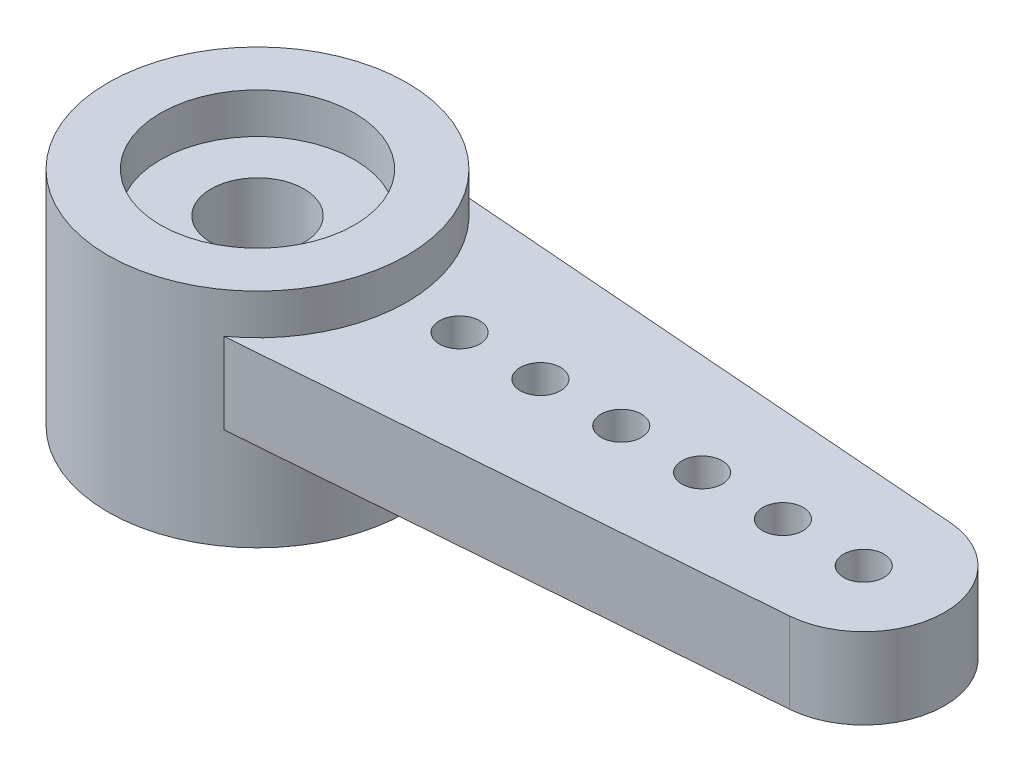
ISO-10303-21;
HEADER;
FILE_DESCRIPTION(('STEP AP214'),'2;1');
FILE_NAME('part.step','',(''),(''),'','','');
FILE_SCHEMA(('AUTOMOTIVE_DESIGN { 1 0 10303 214 1 1 1 1 }'));
ENDSEC;
DATA;
#1=APPLICATION_CONTEXT('core data for automotive mechanical design processes');
#2=APPLICATION_PROTOCOL_DEFINITION('international standard','automotive_design',2000,#1);
#3=PRODUCT_CONTEXT('',#1,'mechanical');
#4=PRODUCT('Part','Part','',(#3));
#5=PRODUCT_RELATED_PRODUCT_CATEGORY('part','',(#4));
#6=PRODUCT_DEFINITION_FORMATION('','',#4);
#7=PRODUCT_DEFINITION_CONTEXT('part definition',#1,'design');
#8=PRODUCT_DEFINITION('design','',#6,#7);
#9=PRODUCT_DEFINITION_SHAPE('','',#8);
#10=(LENGTH_UNIT() NAMED_UNIT(*) SI_UNIT(.MILLI.,.METRE.));
#11=(NAMED_UNIT(*) PLANE_ANGLE_UNIT() SI_UNIT($,.RADIAN.));
#12=(NAMED_UNIT(*) SI_UNIT($,.STERADIAN.) SOLID_ANGLE_UNIT());
#13=UNCERTAINTY_MEASURE_WITH_UNIT(LENGTH_MEASURE(1.E-05),#10,'distance_accuracy_value','');
#14=(GEOMETRIC_REPRESENTATION_CONTEXT(3) GLOBAL_UNCERTAINTY_ASSIGNED_CONTEXT((#13)) GLOBAL_UNIT_ASSIGNED_CONTEXT((#10,
#11,#12)) REPRESENTATION_CONTEXT('',''));
#15=CARTESIAN_POINT('',(0.,0.,0.));
#16=DIRECTION('',(0.,0.,1.));
#17=DIRECTION('',(1.,0.,0.));
#18=AXIS2_PLACEMENT_3D('',#15,#16,#17);
#19=CARTESIAN_POINT('',(0.,0.,0.));
#20=DIRECTION('',(0.,-1.,0.));
#21=DIRECTION('',(0.,0.,-1.));
#22=AXIS2_PLACEMENT_3D('',#19,#20,#21);
#23=CYLINDRICAL_SURFACE('',#22,3.7);
#24=CARTESIAN_POINT('',(0.,5.5,0.));
#25=DIRECTION('',(0.,-1.,0.));
#26=DIRECTION('',(0.,0.,-1.));
#27=AXIS2_PLACEMENT_3D('',#24,#25,#26);
#28=CIRCLE('',#27,3.7);
#29=CARTESIAN_POINT('',(0.,5.5,-3.7));
#30=VERTEX_POINT('',#29);
#31=EDGE_CURVE('E118',#30,#30,#28,.T.);
#32=ORIENTED_EDGE('',*,*,#31,.T.);
#33=EDGE_LOOP('',(#32));
#34=FACE_BOUND('',#33,.T.);
#35=CARTESIAN_POINT('',(0.,0.,0.));
#36=DIRECTION('',(0.,-1.,0.));
#37=DIRECTION('',(0.,0.,-1.));
#38=AXIS2_PLACEMENT_3D('',#35,#36,#37);
#39=CIRCLE('',#38,3.7);
#40=CARTESIAN_POINT('',(0.,0.,-3.7));
#41=VERTEX_POINT('',#40);
#42=EDGE_CURVE('E113',#41,#41,#39,.T.);
#43=ORIENTED_EDGE('',*,*,#42,.F.);
#44=EDGE_LOOP('',(#43));
#45=FACE_BOUND('',#44,.T.);
#46=CARTESIAN_POINT('',(0.,2.5,0.));
#47=DIRECTION('',(0.,-1.,0.));
#48=DIRECTION('',(0.,0.,1.));
#49=AXIS2_PLACEMENT_3D('',#46,#47,#48);
#50=CIRCLE('',#49,3.7);
#51=CARTESIAN_POINT('',(2.16564078277077,2.5,-3.));
#52=VERTEX_POINT('',#51);
#53=CARTESIAN_POINT('',(2.16564078277077,2.5,3.));
#54=VERTEX_POINT('',#53);
#55=EDGE_CURVE('E61',#52,#54,#50,.T.);
#56=ORIENTED_EDGE('',*,*,#55,.T.);
#57=DIRECTION('',(0.,1.,0.));
#58=VECTOR('',#57,1.);
#59=CARTESIAN_POINT('',(2.16564078277077,2.5,3.));
#60=LINE('',#59,#58);
#61=CARTESIAN_POINT('',(2.16564078277077,4.5,3.));
#62=VERTEX_POINT('',#61);
#63=EDGE_CURVE('E85',#54,#62,#60,.T.);
#64=ORIENTED_EDGE('',*,*,#63,.T.);
#65=CARTESIAN_POINT('',(0.,4.5,0.));
#66=DIRECTION('',(0.,-1.,0.));
#67=DIRECTION('',(0.,0.,1.));
#68=AXIS2_PLACEMENT_3D('',#65,#66,#67);
#69=CIRCLE('',#68,3.7);
#70=CARTESIAN_POINT('',(2.16564078277077,4.5,-3.));
#71=VERTEX_POINT('',#70);
#72=EDGE_CURVE('E104',#71,#62,#69,.T.);
#73=ORIENTED_EDGE('',*,*,#72,.F.);
#74=DIRECTION('',(0.,1.,0.));
#75=VECTOR('',#74,1.);
#76=CARTESIAN_POINT('',(2.16564078277077,2.5,-3.));
#77=LINE('',#76,#75);
#78=EDGE_CURVE('E111',#52,#71,#77,.T.);
#79=ORIENTED_EDGE('',*,*,#78,.F.);
#80=EDGE_LOOP('',(#56,#64,#73,#79));
#81=FACE_BOUND('',#80,.T.);
#82=ADVANCED_FACE('F37',(#34,#45,#81),#23,.T.);
#83=CARTESIAN_POINT('',(-3.7,0.,0.));
#84=DIRECTION('',(0.,1.,0.));
#85=DIRECTION('',(0.,0.,1.));
#86=AXIS2_PLACEMENT_3D('',#83,#84,#85);
#87=PLANE('',#86);
#88=CARTESIAN_POINT('',(0.,0.,0.));
#89=DIRECTION('',(0.,-1.,0.));
#90=DIRECTION('',(0.,0.,-1.));
#91=AXIS2_PLACEMENT_3D('',#88,#89,#90);
#92=CIRCLE('',#91,2.4);
#93=CARTESIAN_POINT('',(0.,0.,-2.4));
#94=VERTEX_POINT('',#93);
#95=EDGE_CURVE('E11',#94,#94,#92,.T.);
#96=ORIENTED_EDGE('',*,*,#95,.F.);
#97=EDGE_LOOP('',(#96));
#98=FACE_BOUND('',#97,.T.);
#99=ORIENTED_EDGE('',*,*,#42,.T.);
#100=EDGE_LOOP('',(#99));
#101=FACE_BOUND('',#100,.T.);
#102=ADVANCED_FACE('F39',(#98,#101),#87,.F.);
#103=CARTESIAN_POINT('',(0.,0.,0.));
#104=DIRECTION('',(0.,-1.,0.));
#105=DIRECTION('',(0.,0.,-1.));
#106=AXIS2_PLACEMENT_3D('',#103,#104,#105);
#107=CYLINDRICAL_SURFACE('',#106,2.4);
#108=CARTESIAN_POINT('',(0.,3.,0.));
#109=DIRECTION('',(0.,-1.,0.));
#110=DIRECTION('',(0.,0.,-1.));
#111=AXIS2_PLACEMENT_3D('',#108,#109,#110);
#112=CIRCLE('',#111,2.4);
#113=CARTESIAN_POINT('',(0.,3.,-2.4));
#114=VERTEX_POINT('',#113);
#115=EDGE_CURVE('E45',#114,#114,#112,.T.);
#116=ORIENTED_EDGE('',*,*,#115,.F.);
#117=EDGE_LOOP('',(#116));
#118=FACE_BOUND('',#117,.T.);
#119=ORIENTED_EDGE('',*,*,#95,.T.);
#120=EDGE_LOOP('',(#119));
#121=FACE_BOUND('',#120,.T.);
#122=ADVANCED_FACE('F137',(#118,#121),#107,.F.);
#123=CARTESIAN_POINT('',(-2.4,3.,0.));
#124=DIRECTION('',(0.,1.,0.));
#125=DIRECTION('',(0.,0.,1.));
#126=AXIS2_PLACEMENT_3D('',#123,#124,#125);
#127=PLANE('',#126);
#128=CARTESIAN_POINT('',(0.,3.,0.));
#129=DIRECTION('',(0.,-1.,0.));
#130=DIRECTION('',(0.,0.,-1.));
#131=AXIS2_PLACEMENT_3D('',#128,#129,#130);
#132=CIRCLE('',#131,1.15);
#133=CARTESIAN_POINT('',(0.,3.,-1.15));
#134=VERTEX_POINT('',#133);
#135=EDGE_CURVE('E130',#134,#134,#132,.T.);
#136=ORIENTED_EDGE('',*,*,#135,.F.);
#137=EDGE_LOOP('',(#136));
#138=FACE_BOUND('',#137,.T.);
#139=ORIENTED_EDGE('',*,*,#115,.T.);
#140=EDGE_LOOP('',(#139));
#141=FACE_BOUND('',#140,.T.);
#142=ADVANCED_FACE('F135',(#138,#141),#127,.F.);
#143=CARTESIAN_POINT('',(0.,0.,0.));
#144=DIRECTION('',(0.,-1.,0.));
#145=DIRECTION('',(0.,0.,-1.));
#146=AXIS2_PLACEMENT_3D('',#143,#144,#145);
#147=CYLINDRICAL_SURFACE('',#146,1.15);
#148=CARTESIAN_POINT('',(0.,4.5,0.));
#149=DIRECTION('',(0.,-1.,0.));
#150=DIRECTION('',(0.,0.,-1.));
#151=AXIS2_PLACEMENT_3D('',#148,#149,#150);
#152=CIRCLE('',#151,1.15);
#153=CARTESIAN_POINT('',(0.,4.5,-1.15));
#154=VERTEX_POINT('',#153);
#155=EDGE_CURVE('E127',#154,#154,#152,.T.);
#156=ORIENTED_EDGE('',*,*,#155,.F.);
#157=EDGE_LOOP('',(#156));
#158=FACE_BOUND('',#157,.T.);
#159=ORIENTED_EDGE('',*,*,#135,.T.);
#160=EDGE_LOOP('',(#159));
#161=FACE_BOUND('',#160,.T.);
#162=ADVANCED_FACE('F177',(#158,#161),#147,.F.);
#163=CARTESIAN_POINT('',(-1.15,4.5,0.));
#164=DIRECTION('',(0.,-1.,0.));
#165=DIRECTION('',(0.,0.,-1.));
#166=AXIS2_PLACEMENT_3D('',#163,#164,#165);
#167=PLANE('',#166);
#168=CARTESIAN_POINT('',(0.,4.5,0.));
#169=DIRECTION('',(0.,-1.,0.));
#170=DIRECTION('',(0.,0.,-1.));
#171=AXIS2_PLACEMENT_3D('',#168,#169,#170);
#172=CIRCLE('',#171,2.4);
#173=CARTESIAN_POINT('',(0.,4.5,-2.4));
#174=VERTEX_POINT('',#173);
#175=EDGE_CURVE('E124',#174,#174,#172,.T.);
#176=ORIENTED_EDGE('',*,*,#175,.F.);
#177=EDGE_LOOP('',(#176));
#178=FACE_BOUND('',#177,.T.);
#179=ORIENTED_EDGE('',*,*,#155,.T.);
#180=EDGE_LOOP('',(#179));
#181=FACE_BOUND('',#180,.T.);
#182=ADVANCED_FACE('F173',(#178,#181),#167,.F.);
#183=CARTESIAN_POINT('',(0.,0.,0.));
#184=DIRECTION('',(0.,-1.,0.));
#185=DIRECTION('',(0.,0.,-1.));
#186=AXIS2_PLACEMENT_3D('',#183,#184,#185);
#187=CYLINDRICAL_SURFACE('',#186,2.4);
#188=CARTESIAN_POINT('',(0.,5.5,0.));
#189=DIRECTION('',(0.,-1.,0.));
#190=DIRECTION('',(0.,0.,-1.));
#191=AXIS2_PLACEMENT_3D('',#188,#189,#190);
#192=CIRCLE('',#191,2.4);
#193=CARTESIAN_POINT('',(0.,5.5,-2.4));
#194=VERTEX_POINT('',#193);
#195=EDGE_CURVE('E121',#194,#194,#192,.T.);
#196=ORIENTED_EDGE('',*,*,#195,.F.);
#197=EDGE_LOOP('',(#196));
#198=FACE_BOUND('',#197,.T.);
#199=ORIENTED_EDGE('',*,*,#175,.T.);
#200=EDGE_LOOP('',(#199));
#201=FACE_BOUND('',#200,.T.);
#202=ADVANCED_FACE('F162',(#198,#201),#187,.F.);
#203=CARTESIAN_POINT('',(-2.4,5.5,0.));
#204=DIRECTION('',(0.,-1.,0.));
#205=DIRECTION('',(0.,0.,-1.));
#206=AXIS2_PLACEMENT_3D('',#203,#204,#205);
#207=PLANE('',#206);
#208=ORIENTED_EDGE('',*,*,#31,.F.);
#209=EDGE_LOOP('',(#208));
#210=FACE_BOUND('',#209,.T.);
#211=ORIENTED_EDGE('',*,*,#195,.T.);
#212=EDGE_LOOP('',(#211));
#213=FACE_BOUND('',#212,.T.);
#214=ADVANCED_FACE('F155',(#210,#213),#207,.F.);
#215=CARTESIAN_POINT('',(2.16564078277077,2.5,-3.));
#216=DIRECTION('',(0.0772179348320615,0.,-0.997014237882425));
#217=DIRECTION('',(-0.997014237882424,0.,-0.0772179348320615));
#218=AXIS2_PLACEMENT_3D('',#215,#216,#217);
#219=PLANE('',#218);
#220=DIRECTION('',(-0.997014237882424,0.,-0.0772179348320614));
#221=VECTOR('',#220,1.);
#222=CARTESIAN_POINT('',(2.16564078277077,4.5,-3.));
#223=LINE('',#222,#221);
#224=CARTESIAN_POINT('',(15.1544358696641,4.5,-1.99402847576485));
#225=VERTEX_POINT('',#224);
#226=EDGE_CURVE('E52',#225,#71,#223,.T.);
#227=ORIENTED_EDGE('',*,*,#226,.F.);
#228=DIRECTION('',(0.,1.,0.));
#229=VECTOR('',#228,1.);
#230=CARTESIAN_POINT('',(15.1544358696641,2.5,-1.99402847576485));
#231=LINE('',#230,#229);
#232=CARTESIAN_POINT('',(15.1544358696641,2.5,-1.99402847576485));
#233=VERTEX_POINT('',#232);
#234=EDGE_CURVE('E79',#233,#225,#231,.T.);
#235=ORIENTED_EDGE('',*,*,#234,.F.);
#236=DIRECTION('',(-0.997014237882424,0.,-0.0772179348320614));
#237=VECTOR('',#236,1.);
#238=CARTESIAN_POINT('',(2.16564078277077,2.5,-3.));
#239=LINE('',#238,#237);
#240=EDGE_CURVE('E96',#233,#52,#239,.T.);
#241=ORIENTED_EDGE('',*,*,#240,.T.);
#242=ORIENTED_EDGE('',*,*,#78,.T.);
#243=EDGE_LOOP('',(#227,#235,#241,#242));
#244=FACE_BOUND('',#243,.T.);
#245=ADVANCED_FACE('F153',(#244),#219,.T.);
#246=CARTESIAN_POINT('',(15.,2.5,0.));
#247=DIRECTION('',(0.,1.,0.));
#248=DIRECTION('',(0.,0.,1.));
#249=AXIS2_PLACEMENT_3D('',#246,#247,#248);
#250=CYLINDRICAL_SURFACE('',#249,2.);
#251=CARTESIAN_POINT('',(15.,4.5,0.));
#252=DIRECTION('',(0.,1.,0.));
#253=DIRECTION('',(0.,0.,-1.));
#254=AXIS2_PLACEMENT_3D('',#251,#252,#253);
#255=CIRCLE('',#254,2.);
#256=CARTESIAN_POINT('',(15.1544358696641,4.5,1.99402847576485));
#257=VERTEX_POINT('',#256);
#258=EDGE_CURVE('E91',#257,#225,#255,.T.);
#259=ORIENTED_EDGE('',*,*,#258,.F.);
#260=DIRECTION('',(0.,1.,0.));
#261=VECTOR('',#260,1.);
#262=CARTESIAN_POINT('',(15.1544358696641,2.5,1.99402847576485));
#263=LINE('',#262,#261);
#264=CARTESIAN_POINT('',(15.1544358696641,2.5,1.99402847576485));
#265=VERTEX_POINT('',#264);
#266=EDGE_CURVE('E87',#265,#257,#263,.T.);
#267=ORIENTED_EDGE('',*,*,#266,.F.);
#268=CARTESIAN_POINT('',(15.,2.5,0.));
#269=DIRECTION('',(0.,1.,0.));
#270=DIRECTION('',(0.,0.,-1.));
#271=AXIS2_PLACEMENT_3D('',#268,#269,#270);
#272=CIRCLE('',#271,2.);
#273=EDGE_CURVE('E90',#265,#233,#272,.T.);
#274=ORIENTED_EDGE('',*,*,#273,.T.);
#275=ORIENTED_EDGE('',*,*,#234,.T.);
#276=EDGE_LOOP('',(#259,#267,#274,#275));
#277=FACE_BOUND('',#276,.T.);
#278=ADVANCED_FACE('F89',(#277),#250,.T.);
#279=CARTESIAN_POINT('',(15.1544358696641,2.5,1.99402847576485));
#280=DIRECTION('',(0.0772179348320615,0.,0.997014237882425));
#281=DIRECTION('',(0.997014237882424,0.,-0.0772179348320615));
#282=AXIS2_PLACEMENT_3D('',#279,#280,#281);
#283=PLANE('',#282);
#284=DIRECTION('',(0.997014237882424,0.,-0.0772179348320614));
#285=VECTOR('',#284,1.);
#286=CARTESIAN_POINT('',(15.1544358696641,4.5,1.99402847576485));
#287=LINE('',#286,#285);
#288=EDGE_CURVE('E106',#62,#257,#287,.T.);
#289=ORIENTED_EDGE('',*,*,#288,.F.);
#290=ORIENTED_EDGE('',*,*,#63,.F.);
#291=DIRECTION('',(0.997014237882424,0.,-0.0772179348320614));
#292=VECTOR('',#291,1.);
#293=CARTESIAN_POINT('',(15.1544358696641,2.5,1.99402847576485));
#294=LINE('',#293,#292);
#295=EDGE_CURVE('E95',#54,#265,#294,.T.);
#296=ORIENTED_EDGE('',*,*,#295,.T.);
#297=ORIENTED_EDGE('',*,*,#266,.T.);
#298=EDGE_LOOP('',(#289,#290,#296,#297));
#299=FACE_BOUND('',#298,.T.);
#300=ADVANCED_FACE('F98',(#299),#283,.T.);
#301=CARTESIAN_POINT('',(0.,2.5,0.));
#302=DIRECTION('',(0.,1.,0.));
#303=DIRECTION('',(0.,0.,1.));
#304=AXIS2_PLACEMENT_3D('',#301,#302,#303);
#305=PLANE('',#304);
#306=CARTESIAN_POINT('',(5.,2.5,0.));
#307=DIRECTION('',(0.,1.,0.));
#308=DIRECTION('',(0.,0.,1.));
#309=AXIS2_PLACEMENT_3D('',#306,#307,#308);
#310=CIRCLE('',#309,0.500000000000001);
#311=CARTESIAN_POINT('',(5.,2.5,0.500000000000002));
#312=VERTEX_POINT('',#311);
#313=EDGE_CURVE('E311',#312,#312,#310,.T.);
#314=ORIENTED_EDGE('',*,*,#313,.T.);
#315=EDGE_LOOP('',(#314));
#316=FACE_BOUND('',#315,.T.);
#317=CARTESIAN_POINT('',(7.,2.5,0.));
#318=DIRECTION('',(0.,1.,0.));
#319=DIRECTION('',(0.,0.,1.));
#320=AXIS2_PLACEMENT_3D('',#317,#318,#319);
#321=CIRCLE('',#320,0.500000000000001);
#322=CARTESIAN_POINT('',(7.,2.5,0.500000000000002));
#323=VERTEX_POINT('',#322);
#324=EDGE_CURVE('E319',#323,#323,#321,.T.);
#325=ORIENTED_EDGE('',*,*,#324,.T.);
#326=EDGE_LOOP('',(#325));
#327=FACE_BOUND('',#326,.T.);
#328=CARTESIAN_POINT('',(9.,2.5,0.));
#329=DIRECTION('',(0.,1.,0.));
#330=DIRECTION('',(0.,0.,1.));
#331=AXIS2_PLACEMENT_3D('',#328,#329,#330);
#332=CIRCLE('',#331,0.500000000000001);
#333=CARTESIAN_POINT('',(9.,2.5,0.500000000000002));
#334=VERTEX_POINT('',#333);
#335=EDGE_CURVE('E325',#334,#334,#332,.T.);
#336=ORIENTED_EDGE('',*,*,#335,.T.);
#337=EDGE_LOOP('',(#336));
#338=FACE_BOUND('',#337,.T.);
#339=CARTESIAN_POINT('',(11.,2.5,0.));
#340=DIRECTION('',(0.,1.,0.));
#341=DIRECTION('',(0.,0.,1.));
#342=AXIS2_PLACEMENT_3D('',#339,#340,#341);
#343=CIRCLE('',#342,0.500000000000001);
#344=CARTESIAN_POINT('',(11.,2.5,0.500000000000001));
#345=VERTEX_POINT('',#344);
#346=EDGE_CURVE('E331',#345,#345,#343,.T.);
#347=ORIENTED_EDGE('',*,*,#346,.T.);
#348=EDGE_LOOP('',(#347));
#349=FACE_BOUND('',#348,.T.);
#350=CARTESIAN_POINT('',(13.,2.5,0.));
#351=DIRECTION('',(0.,1.,0.));
#352=DIRECTION('',(0.,0.,1.));
#353=AXIS2_PLACEMENT_3D('',#350,#351,#352);
#354=CIRCLE('',#353,0.500000000000001);
#355=CARTESIAN_POINT('',(13.,2.5,0.500000000000001));
#356=VERTEX_POINT('',#355);
#357=EDGE_CURVE('E337',#356,#356,#354,.T.);
#358=ORIENTED_EDGE('',*,*,#357,.T.);
#359=EDGE_LOOP('',(#358));
#360=FACE_BOUND('',#359,.T.);
#361=CARTESIAN_POINT('',(15.,2.5,0.));
#362=DIRECTION('',(0.,1.,0.));
#363=DIRECTION('',(0.,0.,1.));
#364=AXIS2_PLACEMENT_3D('',#361,#362,#363);
#365=CIRCLE('',#364,0.500000000000001);
#366=CARTESIAN_POINT('',(15.,2.5,0.500000000000001));
#367=VERTEX_POINT('',#366);
#368=EDGE_CURVE('E107',#367,#367,#365,.T.);
#369=ORIENTED_EDGE('',*,*,#368,.T.);
#370=EDGE_LOOP('',(#369));
#371=FACE_BOUND('',#370,.T.);
#372=ORIENTED_EDGE('',*,*,#55,.F.);
#373=ORIENTED_EDGE('',*,*,#240,.F.);
#374=ORIENTED_EDGE('',*,*,#273,.F.);
#375=ORIENTED_EDGE('',*,*,#295,.F.);
#376=EDGE_LOOP('',(#372,#373,#374,#375));
#377=FACE_BOUND('',#376,.T.);
#378=ADVANCED_FACE('F94',(#316,#327,#338,#349,#360,#371,#377),#305,.F.);
#379=CARTESIAN_POINT('',(0.,4.5,0.));
#380=DIRECTION('',(0.,1.,0.));
#381=DIRECTION('',(0.,0.,1.));
#382=AXIS2_PLACEMENT_3D('',#379,#380,#381);
#383=PLANE('',#382);
#384=CARTESIAN_POINT('',(5.,4.5,0.));
#385=DIRECTION('',(0.,1.,0.));
#386=DIRECTION('',(0.,0.,1.));
#387=AXIS2_PLACEMENT_3D('',#384,#385,#386);
#388=CIRCLE('',#387,0.500000000000001);
#389=CARTESIAN_POINT('',(5.,4.5,0.500000000000002));
#390=VERTEX_POINT('',#389);
#391=EDGE_CURVE('E314',#390,#390,#388,.T.);
#392=ORIENTED_EDGE('',*,*,#391,.F.);
#393=EDGE_LOOP('',(#392));
#394=FACE_BOUND('',#393,.T.);
#395=CARTESIAN_POINT('',(7.,4.5,0.));
#396=DIRECTION('',(0.,1.,0.));
#397=DIRECTION('',(0.,0.,1.));
#398=AXIS2_PLACEMENT_3D('',#395,#396,#397);
#399=CIRCLE('',#398,0.500000000000001);
#400=CARTESIAN_POINT('',(7.,4.5,0.500000000000002));
#401=VERTEX_POINT('',#400);
#402=EDGE_CURVE('E316',#401,#401,#399,.T.);
#403=ORIENTED_EDGE('',*,*,#402,.F.);
#404=EDGE_LOOP('',(#403));
#405=FACE_BOUND('',#404,.T.);
#406=CARTESIAN_POINT('',(9.,4.5,0.));
#407=DIRECTION('',(0.,1.,0.));
#408=DIRECTION('',(0.,0.,1.));
#409=AXIS2_PLACEMENT_3D('',#406,#407,#408);
#410=CIRCLE('',#409,0.500000000000001);
#411=CARTESIAN_POINT('',(9.,4.5,0.500000000000002));
#412=VERTEX_POINT('',#411);
#413=EDGE_CURVE('E322',#412,#412,#410,.T.);
#414=ORIENTED_EDGE('',*,*,#413,.F.);
#415=EDGE_LOOP('',(#414));
#416=FACE_BOUND('',#415,.T.);
#417=CARTESIAN_POINT('',(11.,4.5,0.));
#418=DIRECTION('',(0.,1.,0.));
#419=DIRECTION('',(0.,0.,1.));
#420=AXIS2_PLACEMENT_3D('',#417,#418,#419);
#421=CIRCLE('',#420,0.500000000000001);
#422=CARTESIAN_POINT('',(11.,4.5,0.500000000000001));
#423=VERTEX_POINT('',#422);
#424=EDGE_CURVE('E328',#423,#423,#421,.T.);
#425=ORIENTED_EDGE('',*,*,#424,.F.);
#426=EDGE_LOOP('',(#425));
#427=FACE_BOUND('',#426,.T.);
#428=CARTESIAN_POINT('',(13.,4.5,0.));
#429=DIRECTION('',(0.,1.,0.));
#430=DIRECTION('',(0.,0.,1.));
#431=AXIS2_PLACEMENT_3D('',#428,#429,#430);
#432=CIRCLE('',#431,0.500000000000001);
#433=CARTESIAN_POINT('',(13.,4.5,0.500000000000001));
#434=VERTEX_POINT('',#433);
#435=EDGE_CURVE('E334',#434,#434,#432,.T.);
#436=ORIENTED_EDGE('',*,*,#435,.F.);
#437=EDGE_LOOP('',(#436));
#438=FACE_BOUND('',#437,.T.);
#439=CARTESIAN_POINT('',(15.,4.5,0.));
#440=DIRECTION('',(0.,1.,0.));
#441=DIRECTION('',(0.,0.,1.));
#442=AXIS2_PLACEMENT_3D('',#439,#440,#441);
#443=CIRCLE('',#442,0.500000000000001);
#444=CARTESIAN_POINT('',(15.,4.5,0.500000000000001));
#445=VERTEX_POINT('',#444);
#446=EDGE_CURVE('E340',#445,#445,#443,.T.);
#447=ORIENTED_EDGE('',*,*,#446,.F.);
#448=EDGE_LOOP('',(#447));
#449=FACE_BOUND('',#448,.T.);
#450=ORIENTED_EDGE('',*,*,#72,.T.);
#451=ORIENTED_EDGE('',*,*,#288,.T.);
#452=ORIENTED_EDGE('',*,*,#258,.T.);
#453=ORIENTED_EDGE('',*,*,#226,.T.);
#454=EDGE_LOOP('',(#450,#451,#452,#453));
#455=FACE_BOUND('',#454,.T.);
#456=ADVANCED_FACE('F166',(#394,#405,#416,#427,#438,#449,#455),#383,.T.);
#457=CARTESIAN_POINT('',(15.,2.5,0.));
#458=DIRECTION('',(0.,1.,0.));
#459=DIRECTION('',(0.,0.,1.));
#460=AXIS2_PLACEMENT_3D('',#457,#458,#459);
#461=CYLINDRICAL_SURFACE('',#460,0.500000000000001);
#462=ORIENTED_EDGE('',*,*,#368,.F.);
#463=EDGE_LOOP('',(#462));
#464=FACE_BOUND('',#463,.T.);
#465=ORIENTED_EDGE('',*,*,#446,.T.);
#466=EDGE_LOOP('',(#465));
#467=FACE_BOUND('',#466,.T.);
#468=ADVANCED_FACE('F245',(#464,#467),#461,.F.);
#469=CARTESIAN_POINT('',(13.,2.5,0.));
#470=DIRECTION('',(0.,1.,0.));
#471=DIRECTION('',(0.,0.,1.));
#472=AXIS2_PLACEMENT_3D('',#469,#470,#471);
#473=CYLINDRICAL_SURFACE('',#472,0.500000000000001);
#474=ORIENTED_EDGE('',*,*,#357,.F.);
#475=EDGE_LOOP('',(#474));
#476=FACE_BOUND('',#475,.T.);
#477=ORIENTED_EDGE('',*,*,#435,.T.);
#478=EDGE_LOOP('',(#477));
#479=FACE_BOUND('',#478,.T.);
#480=ADVANCED_FACE('F254',(#476,#479),#473,.F.);
#481=CARTESIAN_POINT('',(11.,2.5,0.));
#482=DIRECTION('',(0.,1.,0.));
#483=DIRECTION('',(0.,0.,1.));
#484=AXIS2_PLACEMENT_3D('',#481,#482,#483);
#485=CYLINDRICAL_SURFACE('',#484,0.500000000000001);
#486=ORIENTED_EDGE('',*,*,#346,.F.);
#487=EDGE_LOOP('',(#486));
#488=FACE_BOUND('',#487,.T.);
#489=ORIENTED_EDGE('',*,*,#424,.T.);
#490=EDGE_LOOP('',(#489));
#491=FACE_BOUND('',#490,.T.);
#492=ADVANCED_FACE('F264',(#488,#491),#485,.F.);
#493=CARTESIAN_POINT('',(9.,2.5,0.));
#494=DIRECTION('',(0.,1.,0.));
#495=DIRECTION('',(0.,0.,1.));
#496=AXIS2_PLACEMENT_3D('',#493,#494,#495);
#497=CYLINDRICAL_SURFACE('',#496,0.500000000000001);
#498=ORIENTED_EDGE('',*,*,#335,.F.);
#499=EDGE_LOOP('',(#498));
#500=FACE_BOUND('',#499,.T.);
#501=ORIENTED_EDGE('',*,*,#413,.T.);
#502=EDGE_LOOP('',(#501));
#503=FACE_BOUND('',#502,.T.);
#504=ADVANCED_FACE('F274',(#500,#503),#497,.F.);
#505=CARTESIAN_POINT('',(7.,2.5,0.));
#506=DIRECTION('',(0.,1.,0.));
#507=DIRECTION('',(0.,0.,1.));
#508=AXIS2_PLACEMENT_3D('',#505,#506,#507);
#509=CYLINDRICAL_SURFACE('',#508,0.500000000000001);
#510=ORIENTED_EDGE('',*,*,#324,.F.);
#511=EDGE_LOOP('',(#510));
#512=FACE_BOUND('',#511,.T.);
#513=ORIENTED_EDGE('',*,*,#402,.T.);
#514=EDGE_LOOP('',(#513));
#515=FACE_BOUND('',#514,.T.);
#516=ADVANCED_FACE('F284',(#512,#515),#509,.F.);
#517=CARTESIAN_POINT('',(5.,2.5,0.));
#518=DIRECTION('',(0.,1.,0.));
#519=DIRECTION('',(0.,0.,1.));
#520=AXIS2_PLACEMENT_3D('',#517,#518,#519);
#521=CYLINDRICAL_SURFACE('',#520,0.500000000000001);
#522=ORIENTED_EDGE('',*,*,#313,.F.);
#523=EDGE_LOOP('',(#522));
#524=FACE_BOUND('',#523,.T.);
#525=ORIENTED_EDGE('',*,*,#391,.T.);
#526=EDGE_LOOP('',(#525));
#527=FACE_BOUND('',#526,.T.);
#528=ADVANCED_FACE('F294',(#524,#527),#521,.F.);
#529=CLOSED_SHELL('',(#82,#102,#122,#142,#162,#182,#202,#214,#245,#278,#300,#378,#456,#468,#480,
#492,#504,#516,#528));
#530=MANIFOLD_SOLID_BREP('B2',#529);
#531=ADVANCED_BREP_SHAPE_REPRESENTATION('',(#18,#530),#14);
#532=SHAPE_DEFINITION_REPRESENTATION(#9,#531);
ENDSEC;
END-ISO-10303-21;
